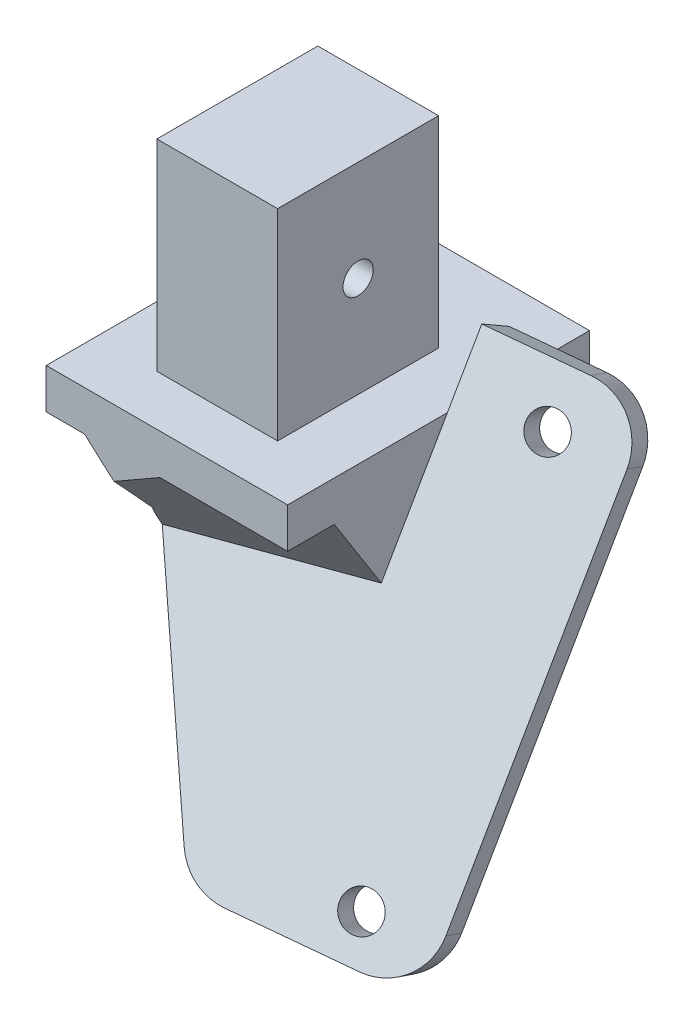
ISO-10303-21;
HEADER;
FILE_DESCRIPTION(('STEP AP214'),'2;1');
FILE_NAME('part.step','',(''),(''),'','','');
FILE_SCHEMA(('AUTOMOTIVE_DESIGN { 1 0 10303 214 1 1 1 1 }'));
ENDSEC;
DATA;
#1=APPLICATION_CONTEXT('core data for automotive mechanical design processes');
#2=APPLICATION_PROTOCOL_DEFINITION('international standard','automotive_design',2000,#1);
#3=PRODUCT_CONTEXT('',#1,'mechanical');
#4=PRODUCT('Part','Part','',(#3));
#5=PRODUCT_RELATED_PRODUCT_CATEGORY('part','',(#4));
#6=PRODUCT_DEFINITION_FORMATION('','',#4);
#7=PRODUCT_DEFINITION_CONTEXT('part definition',#1,'design');
#8=PRODUCT_DEFINITION('design','',#6,#7);
#9=PRODUCT_DEFINITION_SHAPE('','',#8);
#10=(LENGTH_UNIT() NAMED_UNIT(*) SI_UNIT(.MILLI.,.METRE.));
#11=(NAMED_UNIT(*) PLANE_ANGLE_UNIT() SI_UNIT($,.RADIAN.));
#12=(NAMED_UNIT(*) SI_UNIT($,.STERADIAN.) SOLID_ANGLE_UNIT());
#13=UNCERTAINTY_MEASURE_WITH_UNIT(LENGTH_MEASURE(1.E-05),#10,'distance_accuracy_value','');
#14=(GEOMETRIC_REPRESENTATION_CONTEXT(3) GLOBAL_UNCERTAINTY_ASSIGNED_CONTEXT((#13)) GLOBAL_UNIT_ASSIGNED_CONTEXT((#10,
#11,#12)) REPRESENTATION_CONTEXT('',''));
#15=CARTESIAN_POINT('',(0.,0.,0.));
#16=DIRECTION('',(0.,0.,1.));
#17=DIRECTION('',(1.,0.,0.));
#18=AXIS2_PLACEMENT_3D('',#15,#16,#17);
#19=CARTESIAN_POINT('',(0.,0.,0.));
#20=DIRECTION('',(0.,1.,0.));
#21=DIRECTION('',(0.,0.,-1.));
#22=AXIS2_PLACEMENT_3D('',#19,#20,#21);
#23=PLANE('',#22);
#24=DIRECTION('',(0.,0.,1.));
#25=VECTOR('',#24,1.);
#26=CARTESIAN_POINT('',(24.,0.,0.));
#27=LINE('',#26,#25);
#28=CARTESIAN_POINT('',(24.,0.,-4.62668487913654));
#29=VERTEX_POINT('',#28);
#30=CARTESIAN_POINT('',(24.,0.,0.));
#31=VERTEX_POINT('',#30);
#32=EDGE_CURVE('E313',#29,#31,#27,.T.);
#33=ORIENTED_EDGE('',*,*,#32,.T.);
#34=DIRECTION('',(-1.,0.,0.));
#35=VECTOR('',#34,1.);
#36=CARTESIAN_POINT('',(0.,0.,0.));
#37=LINE('',#36,#35);
#38=CARTESIAN_POINT('',(11.2882877676404,0.,0.));
#39=VERTEX_POINT('',#38);
#40=EDGE_CURVE('E303',#31,#39,#37,.T.);
#41=ORIENTED_EDGE('',*,*,#40,.T.);
#42=DIRECTION('',(-0.939692620785907,0.,0.342020143325673));
#43=VECTOR('',#42,1.);
#44=CARTESIAN_POINT('',(10.486715336839,0.,0.291748505420117));
#45=LINE('',#44,#43);
#46=EDGE_CURVE('E488',#29,#39,#45,.T.);
#47=ORIENTED_EDGE('',*,*,#46,.F.);
#48=EDGE_LOOP('',(#33,#41,#47));
#49=FACE_BOUND('',#48,.T.);
#50=ADVANCED_FACE('F41',(#49),#23,.F.);
#51=CARTESIAN_POINT('',(24.9018797354497,9.78209952844714,-19.5429186044547));
#52=DIRECTION('',(0.,-0.866025403784436,0.500000000000004));
#53=DIRECTION('',(0.,0.500000000000004,0.866025403784436));
#54=AXIS2_PLACEMENT_3D('',#51,#52,#53);
#55=PLANE('',#54);
#56=DIRECTION('',(0.953741925422946,-0.150313289241614,-0.260350254019269));
#57=VECTOR('',#56,1.);
#58=CARTESIAN_POINT('',(24.,8.3514866403127,-22.0208128126663));
#59=LINE('',#58,#57);
#60=CARTESIAN_POINT('',(24.,8.3514866403127,-22.0208128126663));
#61=VERTEX_POINT('',#60);
#62=CARTESIAN_POINT('',(31.6299354033836,7.14898032637979,-24.1036148448205));
#63=VERTEX_POINT('',#62);
#64=EDGE_CURVE('E557',#61,#63,#59,.T.);
#65=ORIENTED_EDGE('',*,*,#64,.F.);
#66=DIRECTION('',(0.,0.500000000000004,0.866025403784436));
#67=VECTOR('',#66,1.);
#68=CARTESIAN_POINT('',(24.,9.78209952844714,-19.5429186044547));
#69=LINE('',#68,#67);
#70=CARTESIAN_POINT('',(24.,9.92423914286713,-19.296725570511));
#71=VERTEX_POINT('',#70);
#72=EDGE_CURVE('E233',#61,#71,#69,.T.);
#73=ORIENTED_EDGE('',*,*,#72,.T.);
#74=DIRECTION('',(0.953741925422946,-0.150313289241614,-0.260350254019269));
#75=VECTOR('',#74,1.);
#76=CARTESIAN_POINT('',(24.9018797354497,9.78209952844714,-19.5429186044547));
#77=LINE('',#76,#75);
#78=CARTESIAN_POINT('',(32.5318151388333,8.57959321451423,-21.6257206366088));
#79=VERTEX_POINT('',#78);
#80=EDGE_CURVE('E545',#71,#79,#77,.T.);
#81=ORIENTED_EDGE('',*,*,#80,.T.);
#82=DIRECTION('',(-0.300626578483225,-0.476870962711477,-0.825964736070553));
#83=VECTOR('',#82,1.);
#84=CARTESIAN_POINT('',(32.5318151388333,8.57959321451423,-21.6257206366088));
#85=LINE('',#84,#83);
#86=EDGE_CURVE('E534',#63,#79,#85,.F.);
#87=ORIENTED_EDGE('',*,*,#86,.F.);
#88=EDGE_LOOP('',(#65,#73,#81,#87));
#89=FACE_BOUND('',#88,.T.);
#90=ADVANCED_FACE('F546',(#89),#55,.F.);
#91=CARTESIAN_POINT('',(-1.19973919209316,-1.9030944849345,-3.29625633951065));
#92=DIRECTION('',(-0.300626578483225,-0.476870962711477,-0.825964736070553));
#93=DIRECTION('',(0.,-0.866025403784436,0.500000000000004));
#94=AXIS2_PLACEMENT_3D('',#91,#92,#93);
#95=PLANE('',#94);
#96=CARTESIAN_POINT('',(31.1012022506988,4.47493612945446,-18.7351952555799));
#97=DIRECTION('',(0.300626578483225,0.476870962711477,0.825964736070553));
#98=DIRECTION('',(0.,-0.866025403784436,0.500000000000004));
#99=AXIS2_PLACEMENT_3D('',#96,#97,#98);
#100=CIRCLE('',#99,1.8);
#101=CARTESIAN_POINT('',(31.1012022506988,2.91609040264248,-17.8351952555799));
#102=VERTEX_POINT('',#101);
#103=EDGE_CURVE('E591',#102,#102,#100,.T.);
#104=ORIENTED_EDGE('',*,*,#103,.F.);
#105=EDGE_LOOP('',(#104));
#106=FACE_BOUND('',#105,.T.);
#107=CARTESIAN_POINT('',(31.1012022506988,-27.5680038105697,-0.235195255579716));
#108=DIRECTION('',(0.300626578483225,0.476870962711477,0.825964736070553));
#109=DIRECTION('',(0.,-0.866025403784436,0.500000000000004));
#110=AXIS2_PLACEMENT_3D('',#107,#108,#109);
#111=CIRCLE('',#110,1.8);
#112=CARTESIAN_POINT('',(31.1012022506988,-29.1268495373817,0.664804744420289));
#113=VERTEX_POINT('',#112);
#114=EDGE_CURVE('E234',#113,#113,#111,.T.);
#115=ORIENTED_EDGE('',*,*,#114,.F.);
#116=EDGE_LOOP('',(#115));
#117=FACE_BOUND('',#116,.T.);
#118=CARTESIAN_POINT('',(12.3820748241734,-6.27508701730732,-5.71546130331074));
#119=DIRECTION('',(0.300626578483225,0.476870962711477,0.825964736070553));
#120=DIRECTION('',(0.,-0.866025403784436,0.500000000000004));
#121=AXIS2_PLACEMENT_3D('',#118,#119,#120);
#122=CIRCLE('',#121,5.);
#123=CARTESIAN_POINT('',(8.11681126769891,-7.53935722507935,-3.43310558266799));
#124=VERTEX_POINT('',#123);
#125=CARTESIAN_POINT('',(8.04156708476999,-7.38435481355739,-3.49520962379743));
#126=VERTEX_POINT('',#125);
#127=EDGE_CURVE('E514',#124,#126,#122,.F.);
#128=ORIENTED_EDGE('',*,*,#127,.F.);
#129=DIRECTION('',(-0.426526355647448,0.841818815774649,-0.330781422310677));
#130=VECTOR('',#129,1.);
#131=CARTESIAN_POINT('',(4.4174632412376,-0.23809498526593,-6.30203873442501));
#132=LINE('',#131,#130);
#133=CARTESIAN_POINT('',(17.7402293776953,-26.5327308579097,4.03008605312881));
#134=VERTEX_POINT('',#133);
#135=EDGE_CURVE('E381',#134,#124,#132,.T.);
#136=ORIENTED_EDGE('',*,*,#135,.F.);
#137=CARTESIAN_POINT('',(22.0054929341698,-25.2684606501376,1.74773033248607));
#138=DIRECTION('',(0.300626578483225,0.476870962711477,0.825964736070553));
#139=DIRECTION('',(0.,-0.866025403784436,0.500000000000004));
#140=AXIS2_PLACEMENT_3D('',#137,#138,#139);
#141=CIRCLE('',#140,5.);
#142=CARTESIAN_POINT('',(22.0054929341698,-29.5985876690598,4.24773033248609));
#143=VERTEX_POINT('',#142);
#144=EDGE_CURVE('E521',#143,#134,#141,.F.);
#145=ORIENTED_EDGE('',*,*,#144,.F.);
#146=DIRECTION('',(-0.953741925422947,0.150313289241614,0.260350254019269));
#147=VECTOR('',#146,1.);
#148=CARTESIAN_POINT('',(37.300524765948,-32.0091418057779,0.0725280932950497));
#149=LINE('',#148,#147);
#150=CARTESIAN_POINT('',(32.5318151388333,-31.2575753595698,1.37427936339139));
#151=VERTEX_POINT('',#150);
#152=EDGE_CURVE('E252',#151,#143,#149,.T.);
#153=ORIENTED_EDGE('',*,*,#152,.F.);
#154=CARTESIAN_POINT('',(32.5318151388333,-26.9274483406477,-1.12572063660863));
#155=DIRECTION('',(0.300626578483225,0.476870962711477,0.825964736070553));
#156=DIRECTION('',(0.,-0.866025403784436,0.500000000000004));
#157=AXIS2_PLACEMENT_3D('',#154,#155,#156);
#158=CIRCLE('',#157,5.);
#159=CARTESIAN_POINT('',(37.300524765948,-27.6790147868557,-2.42747190670497));
#160=VERTEX_POINT('',#159);
#161=EDGE_CURVE('E526',#160,#151,#158,.F.);
#162=ORIENTED_EDGE('',*,*,#161,.F.);
#163=DIRECTION('',(0.,-0.866025403784436,0.500000000000004));
#164=VECTOR('',#163,1.);
#165=CARTESIAN_POINT('',(37.300524765948,7.82802676830616,-22.9274719067051));
#166=LINE('',#165,#164);
#167=CARTESIAN_POINT('',(37.300524765948,3.49789974938397,-20.4274719067051));
#168=VERTEX_POINT('',#167);
#169=EDGE_CURVE('E257',#168,#160,#166,.T.);
#170=ORIENTED_EDGE('',*,*,#169,.F.);
#171=CARTESIAN_POINT('',(32.5318151388333,4.24946619559204,-19.1257206366088));
#172=DIRECTION('',(0.300626578483225,0.476870962711477,0.825964736070553));
#173=DIRECTION('',(0.,-0.866025403784436,0.500000000000004));
#174=AXIS2_PLACEMENT_3D('',#171,#172,#173);
#175=CIRCLE('',#174,5.);
#176=EDGE_CURVE('E540',#79,#168,#175,.F.);
#177=ORIENTED_EDGE('',*,*,#176,.F.);
#178=ORIENTED_EDGE('',*,*,#80,.F.);
#179=DIRECTION('',(0.,-0.866025403784436,0.500000000000004));
#180=VECTOR('',#179,1.);
#181=CARTESIAN_POINT('',(24.,-5.87466749124286,-10.1752225724057));
#182=LINE('',#181,#180);
#183=CARTESIAN_POINT('',(24.,4.,-15.8763645066329));
#184=VERTEX_POINT('',#183);
#185=EDGE_CURVE('E554',#71,#184,#182,.T.);
#186=ORIENTED_EDGE('',*,*,#185,.T.);
#187=DIRECTION('',(0.,0.866025403784436,-0.500000000000004));
#188=VECTOR('',#187,1.);
#189=CARTESIAN_POINT('',(24.,-2.87466749124288,-11.9072733799746));
#190=LINE('',#189,#188);
#191=CARTESIAN_POINT('',(24.,-7.38435481355739,-9.30360419047525));
#192=VERTEX_POINT('',#191);
#193=EDGE_CURVE('E251',#192,#184,#190,.T.);
#194=ORIENTED_EDGE('',*,*,#193,.F.);
#195=DIRECTION('',(0.939692620785907,0.,-0.342020143325673));
#196=VECTOR('',#195,1.);
#197=CARTESIAN_POINT('',(25.3702172473642,-7.38435481355739,-9.802322482994));
#198=LINE('',#197,#196);
#199=EDGE_CURVE('E326',#126,#192,#198,.T.);
#200=ORIENTED_EDGE('',*,*,#199,.F.);
#201=EDGE_LOOP('',(#128,#136,#145,#153,#162,#170,#177,#178,#186,#194,#200));
#202=FACE_BOUND('',#201,.T.);
#203=ADVANCED_FACE('F587',(#106,#117,#202),#95,.F.);
#204=CARTESIAN_POINT('',(-2.10161892754284,-3.33370737306893,-5.7741505477223));
#205=DIRECTION('',(-0.300626578483225,-0.476870962711477,-0.825964736070553));
#206=DIRECTION('',(0.,-0.866025403784436,0.500000000000004));
#207=AXIS2_PLACEMENT_3D('',#204,#205,#206);
#208=PLANE('',#207);
#209=DIRECTION('',(0.,0.866025403784436,-0.500000000000004));
#210=VECTOR('',#209,1.);
#211=CARTESIAN_POINT('',(24.,-4.4474199937973,-14.6313606221299));
#212=LINE('',#211,#210);
#213=CARTESIAN_POINT('',(24.,-2.61564518644261,-15.6889363002509));
#214=VERTEX_POINT('',#213);
#215=CARTESIAN_POINT('',(24.,4.,-19.5084808295067));
#216=VERTEX_POINT('',#215);
#217=EDGE_CURVE('E218',#214,#216,#212,.T.);
#218=ORIENTED_EDGE('',*,*,#217,.T.);
#219=DIRECTION('',(0.,-0.866025403784436,0.500000000000004));
#220=VECTOR('',#219,1.);
#221=CARTESIAN_POINT('',(24.,-7.44741999379728,-12.899309814561));
#222=LINE('',#221,#220);
#223=EDGE_CURVE('E237',#61,#216,#222,.T.);
#224=ORIENTED_EDGE('',*,*,#223,.F.);
#225=ORIENTED_EDGE('',*,*,#64,.T.);
#226=CARTESIAN_POINT('',(31.6299354033836,2.81885330745761,-21.6036148448204));
#227=DIRECTION('',(0.300626578483225,0.476870962711477,0.825964736070553));
#228=DIRECTION('',(0.,-0.866025403784436,0.500000000000004));
#229=AXIS2_PLACEMENT_3D('',#226,#227,#228);
#230=CIRCLE('',#229,5.);
#231=CARTESIAN_POINT('',(36.3986450304983,2.06728686124954,-22.9053661149168));
#232=VERTEX_POINT('',#231);
#233=EDGE_CURVE('E505',#232,#63,#230,.T.);
#234=ORIENTED_EDGE('',*,*,#233,.F.);
#235=DIRECTION('',(0.,-0.866025403784436,0.500000000000004));
#236=VECTOR('',#235,1.);
#237=CARTESIAN_POINT('',(36.3986450304983,6.39741388017172,-25.4053661149168));
#238=LINE('',#237,#236);
#239=CARTESIAN_POINT('',(36.3986450304983,-29.1096276749902,-4.90536611491663));
#240=VERTEX_POINT('',#239);
#241=EDGE_CURVE('E559',#232,#240,#238,.T.);
#242=ORIENTED_EDGE('',*,*,#241,.T.);
#243=CARTESIAN_POINT('',(31.6299354033836,-28.3580612287821,-3.60361484482029));
#244=DIRECTION('',(0.300626578483225,0.476870962711477,0.825964736070553));
#245=DIRECTION('',(0.,-0.866025403784436,0.500000000000004));
#246=AXIS2_PLACEMENT_3D('',#243,#244,#245);
#247=CIRCLE('',#246,5.);
#248=CARTESIAN_POINT('',(31.6299354033836,-32.6881882477043,-1.10361484482027));
#249=VERTEX_POINT('',#248);
#250=EDGE_CURVE('E569',#249,#240,#247,.T.);
#251=ORIENTED_EDGE('',*,*,#250,.F.);
#252=DIRECTION('',(-0.953741925422946,0.150313289241614,0.260350254019269));
#253=VECTOR('',#252,1.);
#254=CARTESIAN_POINT('',(6.71148546160899,-28.7609474777343,5.69856570232354));
#255=LINE('',#254,#253);
#256=CARTESIAN_POINT('',(21.1036131987201,-31.0292005571942,1.76983612427443));
#257=VERTEX_POINT('',#256);
#258=EDGE_CURVE('E552',#249,#257,#255,.T.);
#259=ORIENTED_EDGE('',*,*,#258,.T.);
#260=CARTESIAN_POINT('',(21.1036131987201,-26.6990735382721,-0.730163875725593));
#261=DIRECTION('',(0.300626578483225,0.476870962711477,0.825964736070553));
#262=DIRECTION('',(0.,-0.866025403784436,0.500000000000004));
#263=AXIS2_PLACEMENT_3D('',#260,#261,#262);
#264=CIRCLE('',#263,5.);
#265=CARTESIAN_POINT('',(16.8383496422456,-27.9633437460441,1.55219184491716));
#266=VERTEX_POINT('',#265);
#267=EDGE_CURVE('E567',#266,#257,#264,.T.);
#268=ORIENTED_EDGE('',*,*,#267,.F.);
#269=DIRECTION('',(-0.426526355647448,0.841818815774649,-0.330781422310677));
#270=VECTOR('',#269,1.);
#271=CARTESIAN_POINT('',(3.51558350578792,-1.66870787340036,-8.77993294263667));
#272=LINE('',#271,#270);
#273=CARTESIAN_POINT('',(7.21493153224923,-8.96997011321379,-5.91099979087965));
#274=VERTEX_POINT('',#273);
#275=EDGE_CURVE('E589',#266,#274,#272,.T.);
#276=ORIENTED_EDGE('',*,*,#275,.T.);
#277=CARTESIAN_POINT('',(11.4801950887237,-7.70569990544176,-8.19335551152239));
#278=DIRECTION('',(0.300626578483225,0.476870962711477,0.825964736070553));
#279=DIRECTION('',(0.,-0.866025403784436,0.500000000000004));
#280=AXIS2_PLACEMENT_3D('',#277,#278,#279);
#281=CIRCLE('',#280,5.);
#282=CARTESIAN_POINT('',(6.71148546160899,-6.95413345923368,-6.89160424142605));
#283=VERTEX_POINT('',#282);
#284=EDGE_CURVE('E578',#283,#274,#281,.T.);
#285=ORIENTED_EDGE('',*,*,#284,.F.);
#286=DIRECTION('',(0.,0.866025403784436,-0.500000000000004));
#287=VECTOR('',#286,1.);
#288=CARTESIAN_POINT('',(6.71148546160899,11.0762210963497,-17.3014342976767));
#289=LINE('',#288,#287);
#290=CARTESIAN_POINT('',(6.71148546160899,-5.75156644620807,-7.58590663011496));
#291=VERTEX_POINT('',#290);
#292=EDGE_CURVE('E260',#283,#291,#289,.T.);
#293=ORIENTED_EDGE('',*,*,#292,.T.);
#294=DIRECTION('',(-0.680788787401634,0.713808179397935,-0.164330490088779));
#295=VECTOR('',#294,1.);
#296=CARTESIAN_POINT('',(5.16036488299063,-4.12521393168428,-7.96031997179764));
#297=LINE('',#296,#295);
#298=CARTESIAN_POINT('',(3.72062588134553,-2.61564518644261,-8.30784775151222));
#299=VERTEX_POINT('',#298);
#300=EDGE_CURVE('E52',#299,#291,#297,.F.);
#301=ORIENTED_EDGE('',*,*,#300,.F.);
#302=DIRECTION('',(-0.939692620785907,0.,0.342020143325673));
#303=VECTOR('',#302,1.);
#304=CARTESIAN_POINT('',(-2.23486024890906,-2.61564518644261,-6.1402280695143));
#305=LINE('',#304,#303);
#306=EDGE_CURVE('E250',#214,#299,#305,.T.);
#307=ORIENTED_EDGE('',*,*,#306,.F.);
#308=EDGE_LOOP('',(#218,#224,#225,#234,#242,#251,#259,#268,#276,#285,#293,#301,#307));
#309=FACE_BOUND('',#308,.T.);
#310=CARTESIAN_POINT('',(30.1993225152492,3.04432324132003,-21.2130894637915));
#311=DIRECTION('',(0.300626578483225,0.476870962711477,0.825964736070553));
#312=DIRECTION('',(0.,-0.866025403784436,0.500000000000004));
#313=AXIS2_PLACEMENT_3D('',#310,#311,#312);
#314=CIRCLE('',#313,1.8);
#315=CARTESIAN_POINT('',(30.1993225152492,1.48547751450805,-20.3130894637915));
#316=VERTEX_POINT('',#315);
#317=EDGE_CURVE('E599',#316,#316,#314,.T.);
#318=ORIENTED_EDGE('',*,*,#317,.T.);
#319=EDGE_LOOP('',(#318));
#320=FACE_BOUND('',#319,.T.);
#321=CARTESIAN_POINT('',(30.1993225152491,-28.9986166987041,-2.71308946379138));
#322=DIRECTION('',(0.300626578483225,0.476870962711477,0.825964736070553));
#323=DIRECTION('',(0.,-0.866025403784436,0.500000000000004));
#324=AXIS2_PLACEMENT_3D('',#321,#322,#323);
#325=CIRCLE('',#324,1.8);
#326=CARTESIAN_POINT('',(30.1993225152491,-30.5574624255161,-1.81308946379137));
#327=VERTEX_POINT('',#326);
#328=EDGE_CURVE('E597',#327,#327,#325,.T.);
#329=ORIENTED_EDGE('',*,*,#328,.T.);
#330=EDGE_LOOP('',(#329));
#331=FACE_BOUND('',#330,.T.);
#332=ADVANCED_FACE('F247',(#309,#320,#331),#208,.T.);
#333=CARTESIAN_POINT('',(24.,4.,0.));
#334=DIRECTION('',(-1.,0.,0.));
#335=DIRECTION('',(0.,0.,-1.));
#336=AXIS2_PLACEMENT_3D('',#333,#334,#335);
#337=PLANE('',#336);
#338=ORIENTED_EDGE('',*,*,#193,.T.);
#339=DIRECTION('',(0.,0.,1.));
#340=VECTOR('',#339,1.);
#341=CARTESIAN_POINT('',(24.,4.,0.));
#342=LINE('',#341,#340);
#343=CARTESIAN_POINT('',(24.,4.,0.));
#344=VERTEX_POINT('',#343);
#345=EDGE_CURVE('E224',#184,#344,#342,.T.);
#346=ORIENTED_EDGE('',*,*,#345,.T.);
#347=DIRECTION('',(0.,-1.,0.));
#348=VECTOR('',#347,1.);
#349=CARTESIAN_POINT('',(24.,4.,0.));
#350=LINE('',#349,#348);
#351=EDGE_CURVE('E499',#344,#31,#350,.T.);
#352=ORIENTED_EDGE('',*,*,#351,.T.);
#353=ORIENTED_EDGE('',*,*,#32,.F.);
#354=DIRECTION('',(0.,-0.84481073593832,-0.535065248771918));
#355=VECTOR('',#354,1.);
#356=CARTESIAN_POINT('',(24.,4.94621584021188,-1.49397349605606));
#357=LINE('',#356,#355);
#358=EDGE_CURVE('E378',#192,#29,#357,.F.);
#359=ORIENTED_EDGE('',*,*,#358,.F.);
#360=EDGE_LOOP('',(#338,#346,#352,#353,#359));
#361=FACE_BOUND('',#360,.T.);
#362=ADVANCED_FACE('F497',(#361),#337,.F.);
#363=CARTESIAN_POINT('',(0.,4.,0.));
#364=DIRECTION('',(0.,1.,0.));
#365=DIRECTION('',(0.,0.,-1.));
#366=AXIS2_PLACEMENT_3D('',#363,#364,#365);
#367=PLANE('',#366);
#368=DIRECTION('',(0.,0.,1.));
#369=VECTOR('',#368,1.);
#370=CARTESIAN_POINT('',(18.,4.,-5.));
#371=LINE('',#370,#369);
#372=CARTESIAN_POINT('',(18.,4.,-21.));
#373=VERTEX_POINT('',#372);
#374=CARTESIAN_POINT('',(18.,4.,-5.));
#375=VERTEX_POINT('',#374);
#376=EDGE_CURVE('E286',#373,#375,#371,.T.);
#377=ORIENTED_EDGE('',*,*,#376,.T.);
#378=DIRECTION('',(-1.,0.,0.));
#379=VECTOR('',#378,1.);
#380=CARTESIAN_POINT('',(6.00000000000001,4.,-5.));
#381=LINE('',#380,#379);
#382=CARTESIAN_POINT('',(6.00000000000001,4.,-5.));
#383=VERTEX_POINT('',#382);
#384=EDGE_CURVE('E273',#375,#383,#381,.T.);
#385=ORIENTED_EDGE('',*,*,#384,.T.);
#386=DIRECTION('',(0.,0.,-1.));
#387=VECTOR('',#386,1.);
#388=CARTESIAN_POINT('',(6.00000000000001,4.,-5.));
#389=LINE('',#388,#387);
#390=CARTESIAN_POINT('',(6.00000000000001,4.,-21.));
#391=VERTEX_POINT('',#390);
#392=EDGE_CURVE('E266',#383,#391,#389,.T.);
#393=ORIENTED_EDGE('',*,*,#392,.T.);
#394=DIRECTION('',(1.,0.,0.));
#395=VECTOR('',#394,1.);
#396=CARTESIAN_POINT('',(6.00000000000001,4.,-21.));
#397=LINE('',#396,#395);
#398=EDGE_CURVE('E283',#391,#373,#397,.T.);
#399=ORIENTED_EDGE('',*,*,#398,.T.);
#400=EDGE_LOOP('',(#377,#385,#393,#399));
#401=FACE_BOUND('',#400,.T.);
#402=ORIENTED_EDGE('',*,*,#345,.F.);
#403=DIRECTION('',(0.,0.,1.));
#404=VECTOR('',#403,1.);
#405=CARTESIAN_POINT('',(24.,4.,-23.5414123331734));
#406=LINE('',#405,#404);
#407=EDGE_CURVE('E227',#216,#184,#406,.T.);
#408=ORIENTED_EDGE('',*,*,#407,.F.);
#409=CARTESIAN_POINT('',(24.,4.,-30.));
#410=VERTEX_POINT('',#409);
#411=EDGE_CURVE('E213',#410,#216,#342,.T.);
#412=ORIENTED_EDGE('',*,*,#411,.F.);
#413=DIRECTION('',(1.,0.,0.));
#414=VECTOR('',#413,1.);
#415=CARTESIAN_POINT('',(0.,4.,-30.));
#416=LINE('',#415,#414);
#417=CARTESIAN_POINT('',(0.,4.,-30.));
#418=VERTEX_POINT('',#417);
#419=EDGE_CURVE('E302',#418,#410,#416,.T.);
#420=ORIENTED_EDGE('',*,*,#419,.F.);
#421=DIRECTION('',(0.,0.,-1.));
#422=VECTOR('',#421,1.);
#423=CARTESIAN_POINT('',(0.,4.,0.));
#424=LINE('',#423,#422);
#425=CARTESIAN_POINT('',(0.,4.,0.));
#426=VERTEX_POINT('',#425);
#427=EDGE_CURVE('E299',#426,#418,#424,.T.);
#428=ORIENTED_EDGE('',*,*,#427,.F.);
#429=DIRECTION('',(-1.,0.,0.));
#430=VECTOR('',#429,1.);
#431=CARTESIAN_POINT('',(0.,4.,0.));
#432=LINE('',#431,#430);
#433=EDGE_CURVE('E223',#344,#426,#432,.T.);
#434=ORIENTED_EDGE('',*,*,#433,.F.);
#435=EDGE_LOOP('',(#402,#408,#412,#420,#428,#434));
#436=FACE_BOUND('',#435,.T.);
#437=ADVANCED_FACE('F229',(#401,#436),#367,.T.);
#438=CARTESIAN_POINT('',(3.82069132181488,0.,0.));
#439=VERTEX_POINT('',#438);
#440=CARTESIAN_POINT('',(0.,0.,0.));
#441=VERTEX_POINT('',#440);
#442=EDGE_CURVE('E317',#439,#441,#37,.T.);
#443=ORIENTED_EDGE('',*,*,#442,.T.);
#444=DIRECTION('',(0.,0.,-1.));
#445=VECTOR('',#444,1.);
#446=CARTESIAN_POINT('',(0.,0.,0.));
#447=LINE('',#446,#445);
#448=CARTESIAN_POINT('',(0.,0.,-30.));
#449=VERTEX_POINT('',#448);
#450=EDGE_CURVE('E298',#441,#449,#447,.T.);
#451=ORIENTED_EDGE('',*,*,#450,.T.);
#452=DIRECTION('',(1.,0.,0.));
#453=VECTOR('',#452,1.);
#454=CARTESIAN_POINT('',(0.,0.,-30.));
#455=LINE('',#454,#453);
#456=CARTESIAN_POINT('',(24.,0.,-30.));
#457=VERTEX_POINT('',#456);
#458=EDGE_CURVE('E310',#449,#457,#455,.T.);
#459=ORIENTED_EDGE('',*,*,#458,.T.);
#460=CARTESIAN_POINT('',(24.,0.,-20.3658556115896));
#461=VERTEX_POINT('',#460);
#462=EDGE_CURVE('E314',#457,#461,#27,.T.);
#463=ORIENTED_EDGE('',*,*,#462,.T.);
#464=DIRECTION('',(0.939692620785907,0.,-0.342020143325673));
#465=VECTOR('',#464,1.);
#466=CARTESIAN_POINT('',(-3.73799314132519,0.,-10.2700517498671));
#467=LINE('',#466,#465);
#468=CARTESIAN_POINT('',(0.439642942078132,0.,-11.7905869338223));
#469=VERTEX_POINT('',#468);
#470=EDGE_CURVE('E328',#469,#461,#467,.T.);
#471=ORIENTED_EDGE('',*,*,#470,.F.);
#472=DIRECTION('',(-0.263342239326904,0.,-0.964702474852372));
#473=VECTOR('',#472,1.);
#474=CARTESIAN_POINT('',(1.09917027915965,0.,-9.37453831229634));
#475=LINE('',#474,#473);
#476=CARTESIAN_POINT('',(2.70089204368231,0.,-3.50694580526302));
#477=VERTEX_POINT('',#476);
#478=EDGE_CURVE('E331',#477,#469,#475,.T.);
#479=ORIENTED_EDGE('',*,*,#478,.F.);
#480=CARTESIAN_POINT('',(4.89402018745804,0.,2.65727949453189));
#481=CARTESIAN_POINT('',(4.01382894624458,0.,0.670319460041967));
#482=CARTESIAN_POINT('',(3.27079630282216,0.,-1.41812239966285));
#483=CARTESIAN_POINT('',(2.70089204368231,0.,-3.50694580526302));
#484=B_SPLINE_CURVE_WITH_KNOTS('',3,(#480,#481,#482,#483),.UNSPECIFIED.,.F.,.F.,(4,4),
(4.57093154388576,4.88424373170343),.UNSPECIFIED.);
#485=EDGE_CURVE('E337',#439,#477,#484,.T.);
#486=ORIENTED_EDGE('',*,*,#485,.F.);
#487=EDGE_LOOP('',(#443,#451,#459,#463,#471,#479,#486));
#488=FACE_BOUND('',#487,.T.);
#489=ADVANCED_FACE('F344',(#488),#23,.F.);
#490=CARTESIAN_POINT('',(18.,24.,-5.));
#491=DIRECTION('',(-1.,0.,0.));
#492=DIRECTION('',(0.,0.,-1.));
#493=AXIS2_PLACEMENT_3D('',#490,#491,#492);
#494=PLANE('',#493);
#495=CARTESIAN_POINT('',(18.,14.,-13.));
#496=DIRECTION('',(-1.,0.,0.));
#497=DIRECTION('',(0.,0.,1.));
#498=AXIS2_PLACEMENT_3D('',#495,#496,#497);
#499=CIRCLE('',#498,1.5);
#500=CARTESIAN_POINT('',(18.,14.,-11.5));
#501=VERTEX_POINT('',#500);
#502=EDGE_CURVE('E254',#501,#501,#499,.T.);
#503=ORIENTED_EDGE('',*,*,#502,.T.);
#504=EDGE_LOOP('',(#503));
#505=FACE_BOUND('',#504,.T.);
#506=ORIENTED_EDGE('',*,*,#376,.F.);
#507=DIRECTION('',(0.,-1.,0.));
#508=VECTOR('',#507,1.);
#509=CARTESIAN_POINT('',(18.,24.,-21.));
#510=LINE('',#509,#508);
#511=CARTESIAN_POINT('',(18.,24.,-21.));
#512=VERTEX_POINT('',#511);
#513=EDGE_CURVE('E294',#512,#373,#510,.T.);
#514=ORIENTED_EDGE('',*,*,#513,.F.);
#515=DIRECTION('',(0.,0.,1.));
#516=VECTOR('',#515,1.);
#517=CARTESIAN_POINT('',(18.,24.,-5.));
#518=LINE('',#517,#516);
#519=CARTESIAN_POINT('',(18.,24.,-5.));
#520=VERTEX_POINT('',#519);
#521=EDGE_CURVE('E275',#512,#520,#518,.T.);
#522=ORIENTED_EDGE('',*,*,#521,.T.);
#523=DIRECTION('',(0.,-1.,0.));
#524=VECTOR('',#523,1.);
#525=CARTESIAN_POINT('',(18.,24.,-5.));
#526=LINE('',#525,#524);
#527=EDGE_CURVE('E292',#520,#375,#526,.T.);
#528=ORIENTED_EDGE('',*,*,#527,.T.);
#529=EDGE_LOOP('',(#506,#514,#522,#528));
#530=FACE_BOUND('',#529,.T.);
#531=ADVANCED_FACE('F354',(#505,#530),#494,.F.);
#532=CARTESIAN_POINT('',(0.,4.,0.));
#533=DIRECTION('',(1.,0.,0.));
#534=DIRECTION('',(0.,0.,1.));
#535=AXIS2_PLACEMENT_3D('',#532,#533,#534);
#536=PLANE('',#535);
#537=ORIENTED_EDGE('',*,*,#450,.F.);
#538=DIRECTION('',(0.,-1.,0.));
#539=VECTOR('',#538,1.);
#540=CARTESIAN_POINT('',(0.,4.,0.));
#541=LINE('',#540,#539);
#542=EDGE_CURVE('E307',#426,#441,#541,.T.);
#543=ORIENTED_EDGE('',*,*,#542,.F.);
#544=ORIENTED_EDGE('',*,*,#427,.T.);
#545=DIRECTION('',(0.,-1.,0.));
#546=VECTOR('',#545,1.);
#547=CARTESIAN_POINT('',(0.,4.,-30.));
#548=LINE('',#547,#546);
#549=EDGE_CURVE('E244',#418,#449,#548,.T.);
#550=ORIENTED_EDGE('',*,*,#549,.T.);
#551=EDGE_LOOP('',(#537,#543,#544,#550));
#552=FACE_BOUND('',#551,.T.);
#553=ADVANCED_FACE('F470',(#552),#536,.F.);
#554=CARTESIAN_POINT('',(0.,4.,-30.));
#555=DIRECTION('',(0.,0.,1.));
#556=DIRECTION('',(-1.,0.,0.));
#557=AXIS2_PLACEMENT_3D('',#554,#555,#556);
#558=PLANE('',#557);
#559=ORIENTED_EDGE('',*,*,#458,.F.);
#560=ORIENTED_EDGE('',*,*,#549,.F.);
#561=ORIENTED_EDGE('',*,*,#419,.T.);
#562=DIRECTION('',(0.,-1.,0.));
#563=VECTOR('',#562,1.);
#564=CARTESIAN_POINT('',(24.,4.,-30.));
#565=LINE('',#564,#563);
#566=EDGE_CURVE('E219',#410,#457,#565,.T.);
#567=ORIENTED_EDGE('',*,*,#566,.T.);
#568=EDGE_LOOP('',(#559,#560,#561,#567));
#569=FACE_BOUND('',#568,.T.);
#570=ADVANCED_FACE('F684',(#569),#558,.F.);
#571=ORIENTED_EDGE('',*,*,#462,.F.);
#572=ORIENTED_EDGE('',*,*,#566,.F.);
#573=ORIENTED_EDGE('',*,*,#411,.T.);
#574=ORIENTED_EDGE('',*,*,#217,.F.);
#575=DIRECTION('',(0.,-0.488116069350405,0.872778725016777));
#576=VECTOR('',#575,1.);
#577=CARTESIAN_POINT('',(24.,-7.72317805212531,-6.55638299500066));
#578=LINE('',#577,#576);
#579=EDGE_CURVE('E12',#461,#214,#578,.T.);
#580=ORIENTED_EDGE('',*,*,#579,.F.);
#581=EDGE_LOOP('',(#571,#572,#573,#574,#580));
#582=FACE_BOUND('',#581,.T.);
#583=ADVANCED_FACE('F216',(#582),#337,.F.);
#584=CARTESIAN_POINT('',(0.,4.,0.));
#585=DIRECTION('',(0.,0.,-1.));
#586=DIRECTION('',(1.,0.,0.));
#587=AXIS2_PLACEMENT_3D('',#584,#585,#586);
#588=PLANE('',#587);
#589=ORIENTED_EDGE('',*,*,#40,.F.);
#590=ORIENTED_EDGE('',*,*,#351,.F.);
#591=ORIENTED_EDGE('',*,*,#433,.T.);
#592=ORIENTED_EDGE('',*,*,#542,.T.);
#593=ORIENTED_EDGE('',*,*,#442,.F.);
#594=CARTESIAN_POINT('',(6.75041122688828,-2.60778163853519,0.));
#595=CARTESIAN_POINT('',(6.63091366495885,-2.50704812057528,4.310139354026E-08));
#596=CARTESIAN_POINT('',(6.5117700823799,-2.40589508868888,5.33396422806928E-07));
#597=CARTESIAN_POINT('',(6.27261453045539,-2.20144802467374,1.89152551582587E-06));
#598=CARTESIAN_POINT('',(6.15261168665314,-2.09814331682844,2.76423012082665E-06));
#599=CARTESIAN_POINT('',(5.91174968210769,-1.88939542413768,4.3515895397889E-06));
#600=CARTESIAN_POINT('',(5.79089951759188,-1.78394186113436,5.0640544054162E-06));
#601=CARTESIAN_POINT('',(5.54835489710783,-1.57089868718561,6.05289727428703E-06));
#602=CARTESIAN_POINT('',(5.42666930924843,-1.4632989812427,6.32360196576936E-06));
#603=CARTESIAN_POINT('',(5.18246559031736,-1.24596650399289,6.32698697385845E-06));
#604=CARTESIAN_POINT('',(5.05995619755419,-1.13622391529595,6.05286731526203E-06));
#605=CARTESIAN_POINT('',(4.81411641250837,-0.914608990186521,5.06752552006209E-06));
#606=CARTESIAN_POINT('',(4.69079462815453,-0.802727105954399,4.35093492849829E-06));
#607=CARTESIAN_POINT('',(4.44334132198181,-0.576837423906528,2.76525250803213E-06));
#608=CARTESIAN_POINT('',(4.31921827633043,-0.462820342376104,1.89440683671371E-06));
#609=CARTESIAN_POINT('',(4.07017364466965,-0.232664068438034,5.23772311360385E-07));
#610=CARTESIAN_POINT('',(3.94526040446976,-0.116515844584746,2.85713381097432E-08));
#611=CARTESIAN_POINT('',(3.82069132181467,0.,0.));
#612=B_SPLINE_CURVE_WITH_KNOTS('',3,(#594,#595,#596,#597,#598,#599,#600,#601,#602,#603,#604,
#605,#606,#607,#608,#609,#610,#611),.UNSPECIFIED.,.F.,.F.,(4,2,2,2,2,2,2,2,4),(0.,
0.468871970438724,0.943897631426633,1.42506658795273,1.91236767786124,2.40578898719397,
2.90531786514872,3.41094093867571,3.9226441267314),.UNSPECIFIED.);
#613=CARTESIAN_POINT('',(6.75041122688828,-2.60778163853519,0.));
#614=VERTEX_POINT('',#613);
#615=EDGE_CURVE('E443',#614,#439,#612,.T.);
#616=ORIENTED_EDGE('',*,*,#615,.F.);
#617=DIRECTION('',(0.867029906258276,0.498256100468188,0.));
#618=VECTOR('',#617,1.);
#619=CARTESIAN_POINT('',(4.53043239226129,-3.88353693749215,0.));
#620=LINE('',#619,#618);
#621=EDGE_CURVE('E370',#39,#614,#620,.F.);
#622=ORIENTED_EDGE('',*,*,#621,.F.);
#623=EDGE_LOOP('',(#589,#590,#591,#592,#593,#616,#622));
#624=FACE_BOUND('',#623,.T.);
#625=ADVANCED_FACE('F356',(#624),#588,.F.);
#626=CARTESIAN_POINT('',(6.00000000000001,24.,-5.));
#627=DIRECTION('',(1.,0.,0.));
#628=DIRECTION('',(0.,0.,1.));
#629=AXIS2_PLACEMENT_3D('',#626,#627,#628);
#630=PLANE('',#629);
#631=CARTESIAN_POINT('',(5.99999999999999,14.,-13.));
#632=DIRECTION('',(-1.,0.,0.));
#633=DIRECTION('',(0.,0.,1.));
#634=AXIS2_PLACEMENT_3D('',#631,#632,#633);
#635=CIRCLE('',#634,1.5);
#636=CARTESIAN_POINT('',(5.99999999999999,14.,-11.5));
#637=VERTEX_POINT('',#636);
#638=EDGE_CURVE('E263',#637,#637,#635,.T.);
#639=ORIENTED_EDGE('',*,*,#638,.F.);
#640=EDGE_LOOP('',(#639));
#641=FACE_BOUND('',#640,.T.);
#642=ORIENTED_EDGE('',*,*,#392,.F.);
#643=DIRECTION('',(0.,-1.,0.));
#644=VECTOR('',#643,1.);
#645=CARTESIAN_POINT('',(6.00000000000001,24.,-5.));
#646=LINE('',#645,#644);
#647=CARTESIAN_POINT('',(6.00000000000001,24.,-5.));
#648=VERTEX_POINT('',#647);
#649=EDGE_CURVE('E280',#648,#383,#646,.T.);
#650=ORIENTED_EDGE('',*,*,#649,.F.);
#651=DIRECTION('',(0.,0.,-1.));
#652=VECTOR('',#651,1.);
#653=CARTESIAN_POINT('',(6.00000000000001,24.,-5.));
#654=LINE('',#653,#652);
#655=CARTESIAN_POINT('',(6.00000000000001,24.,-21.));
#656=VERTEX_POINT('',#655);
#657=EDGE_CURVE('E269',#648,#656,#654,.T.);
#658=ORIENTED_EDGE('',*,*,#657,.T.);
#659=DIRECTION('',(0.,-1.,0.));
#660=VECTOR('',#659,1.);
#661=CARTESIAN_POINT('',(6.00000000000001,24.,-21.));
#662=LINE('',#661,#660);
#663=EDGE_CURVE('E296',#656,#391,#662,.T.);
#664=ORIENTED_EDGE('',*,*,#663,.T.);
#665=EDGE_LOOP('',(#642,#650,#658,#664));
#666=FACE_BOUND('',#665,.T.);
#667=ADVANCED_FACE('F360',(#641,#666),#630,.F.);
#668=CARTESIAN_POINT('',(6.00000000000001,24.,-21.));
#669=DIRECTION('',(0.,0.,1.));
#670=DIRECTION('',(-1.,0.,0.));
#671=AXIS2_PLACEMENT_3D('',#668,#669,#670);
#672=PLANE('',#671);
#673=ORIENTED_EDGE('',*,*,#398,.F.);
#674=ORIENTED_EDGE('',*,*,#663,.F.);
#675=DIRECTION('',(1.,0.,0.));
#676=VECTOR('',#675,1.);
#677=CARTESIAN_POINT('',(6.00000000000001,24.,-21.));
#678=LINE('',#677,#676);
#679=EDGE_CURVE('E272',#656,#512,#678,.T.);
#680=ORIENTED_EDGE('',*,*,#679,.T.);
#681=ORIENTED_EDGE('',*,*,#513,.T.);
#682=EDGE_LOOP('',(#673,#674,#680,#681));
#683=FACE_BOUND('',#682,.T.);
#684=ADVANCED_FACE('F650',(#683),#672,.F.);
#685=CARTESIAN_POINT('',(6.00000000000001,24.,-5.));
#686=DIRECTION('',(0.,0.,-1.));
#687=DIRECTION('',(1.,0.,0.));
#688=AXIS2_PLACEMENT_3D('',#685,#686,#687);
#689=PLANE('',#688);
#690=ORIENTED_EDGE('',*,*,#384,.F.);
#691=ORIENTED_EDGE('',*,*,#527,.F.);
#692=DIRECTION('',(-1.,0.,0.));
#693=VECTOR('',#692,1.);
#694=CARTESIAN_POINT('',(6.00000000000001,24.,-5.));
#695=LINE('',#694,#693);
#696=EDGE_CURVE('E278',#520,#648,#695,.T.);
#697=ORIENTED_EDGE('',*,*,#696,.T.);
#698=ORIENTED_EDGE('',*,*,#649,.T.);
#699=EDGE_LOOP('',(#690,#691,#697,#698));
#700=FACE_BOUND('',#699,.T.);
#701=ADVANCED_FACE('F646',(#700),#689,.F.);
#702=CARTESIAN_POINT('',(0.,24.,0.));
#703=DIRECTION('',(0.,1.,0.));
#704=DIRECTION('',(0.,0.,-1.));
#705=AXIS2_PLACEMENT_3D('',#702,#703,#704);
#706=PLANE('',#705);
#707=ORIENTED_EDGE('',*,*,#657,.F.);
#708=ORIENTED_EDGE('',*,*,#696,.F.);
#709=ORIENTED_EDGE('',*,*,#521,.F.);
#710=ORIENTED_EDGE('',*,*,#679,.F.);
#711=EDGE_LOOP('',(#707,#708,#709,#710));
#712=FACE_BOUND('',#711,.T.);
#713=ADVANCED_FACE('F642',(#712),#706,.T.);
#714=CARTESIAN_POINT('',(5.99999999999999,14.,-13.));
#715=DIRECTION('',(1.,0.,0.));
#716=DIRECTION('',(0.,0.,1.));
#717=AXIS2_PLACEMENT_3D('',#714,#715,#716);
#718=CYLINDRICAL_SURFACE('',#717,1.5);
#719=ORIENTED_EDGE('',*,*,#638,.T.);
#720=EDGE_LOOP('',(#719));
#721=FACE_BOUND('',#720,.T.);
#722=ORIENTED_EDGE('',*,*,#502,.F.);
#723=EDGE_LOOP('',(#722));
#724=FACE_BOUND('',#723,.T.);
#725=ADVANCED_FACE('F638',(#721,#724),#718,.F.);
#726=CARTESIAN_POINT('',(7.61336519705867,12.5068339844842,-14.823540089465));
#727=DIRECTION('',(0.953741925422946,-0.150313289241614,-0.260350254019269));
#728=DIRECTION('',(0.263342239326904,0.,0.964702474852372));
#729=AXIS2_PLACEMENT_3D('',#726,#727,#728);
#730=PLANE('',#729);
#731=ORIENTED_EDGE('',*,*,#292,.F.);
#732=DIRECTION('',(-0.300626578483225,-0.476870962711477,-0.825964736070553));
#733=VECTOR('',#732,1.);
#734=CARTESIAN_POINT('',(7.61336519705867,-5.52352057109926,-4.41371003321439));
#735=LINE('',#734,#733);
#736=CARTESIAN_POINT('',(7.46960167079705,-5.75156644620807,-4.80869707535936));
#737=VERTEX_POINT('',#736);
#738=EDGE_CURVE('E243',#737,#283,#735,.T.);
#739=ORIENTED_EDGE('',*,*,#738,.F.);
#740=DIRECTION('',(0.263342239326904,0.,0.964702474852372));
#741=VECTOR('',#740,1.);
#742=CARTESIAN_POINT('',(6.76975964172406,-5.75156644620807,-7.37243063811046));
#743=LINE('',#742,#741);
#744=EDGE_CURVE('E495',#291,#737,#743,.T.);
#745=ORIENTED_EDGE('',*,*,#744,.F.);
#746=EDGE_LOOP('',(#731,#739,#745));
#747=FACE_BOUND('',#746,.T.);
#748=ADVANCED_FACE('F641',(#747),#730,.F.);
#749=CARTESIAN_POINT('',(37.300524765948,7.82802676830616,-22.9274719067051));
#750=DIRECTION('',(-0.953741925422946,0.150313289241614,0.260350254019269));
#751=DIRECTION('',(-0.263342239326904,0.,-0.964702474852372));
#752=AXIS2_PLACEMENT_3D('',#749,#750,#751);
#753=PLANE('',#752);
#754=ORIENTED_EDGE('',*,*,#241,.F.);
#755=DIRECTION('',(-0.300626578483225,-0.476870962711477,-0.825964736070553));
#756=VECTOR('',#755,1.);
#757=CARTESIAN_POINT('',(37.300524765948,3.49789974938397,-20.4274719067051));
#758=LINE('',#757,#756);
#759=EDGE_CURVE('E531',#168,#232,#758,.T.);
#760=ORIENTED_EDGE('',*,*,#759,.F.);
#761=ORIENTED_EDGE('',*,*,#169,.T.);
#762=DIRECTION('',(-0.300626578483225,-0.476870962711477,-0.825964736070553));
#763=VECTOR('',#762,1.);
#764=CARTESIAN_POINT('',(37.300524765948,-27.6790147868557,-2.42747190670497));
#765=LINE('',#764,#763);
#766=EDGE_CURVE('E533',#240,#160,#765,.F.);
#767=ORIENTED_EDGE('',*,*,#766,.F.);
#768=EDGE_LOOP('',(#754,#760,#761,#767));
#769=FACE_BOUND('',#768,.T.);
#770=ADVANCED_FACE('F636',(#769),#753,.F.);
#771=CARTESIAN_POINT('',(7.61336519705866,-27.3303345895999,8.1764599105352));
#772=DIRECTION('',(0.,0.866025403784436,-0.500000000000004));
#773=DIRECTION('',(0.,-0.500000000000004,-0.866025403784436));
#774=AXIS2_PLACEMENT_3D('',#771,#772,#773);
#775=PLANE('',#774);
#776=ORIENTED_EDGE('',*,*,#258,.F.);
#777=DIRECTION('',(-0.300626578483225,-0.476870962711477,-0.825964736070553));
#778=VECTOR('',#777,1.);
#779=CARTESIAN_POINT('',(32.5318151388333,-31.2575753595698,1.37427936339139));
#780=LINE('',#779,#778);
#781=EDGE_CURVE('E520',#151,#249,#780,.T.);
#782=ORIENTED_EDGE('',*,*,#781,.F.);
#783=ORIENTED_EDGE('',*,*,#152,.T.);
#784=DIRECTION('',(-0.300626578483225,-0.476870962711477,-0.825964736070553));
#785=VECTOR('',#784,1.);
#786=CARTESIAN_POINT('',(22.0054929341698,-29.5985876690598,4.24773033248609));
#787=LINE('',#786,#785);
#788=EDGE_CURVE('E523',#257,#143,#787,.F.);
#789=ORIENTED_EDGE('',*,*,#788,.F.);
#790=EDGE_LOOP('',(#776,#782,#783,#789));
#791=FACE_BOUND('',#790,.T.);
#792=ADVANCED_FACE('F571',(#791),#775,.F.);
#793=CARTESIAN_POINT('',(24.,14.,-23.5414123331734));
#794=DIRECTION('',(-1.,0.,0.));
#795=DIRECTION('',(0.,0.,-1.));
#796=AXIS2_PLACEMENT_3D('',#793,#794,#795);
#797=PLANE('',#796);
#798=ORIENTED_EDGE('',*,*,#185,.F.);
#799=ORIENTED_EDGE('',*,*,#72,.F.);
#800=ORIENTED_EDGE('',*,*,#223,.T.);
#801=ORIENTED_EDGE('',*,*,#407,.T.);
#802=EDGE_LOOP('',(#798,#799,#800,#801));
#803=FACE_BOUND('',#802,.T.);
#804=ADVANCED_FACE('F238',(#803),#797,.T.);
#805=CARTESIAN_POINT('',(4.4174632412376,-0.23809498526593,-6.30203873442501));
#806=DIRECTION('',(0.853052711294897,0.252854041554406,-0.45647114412855));
#807=DIRECTION('',(0.471802636914221,0.,0.881704186108236));
#808=AXIS2_PLACEMENT_3D('',#805,#806,#807);
#809=PLANE('',#808);
#810=ORIENTED_EDGE('',*,*,#275,.F.);
#811=DIRECTION('',(-0.300626578483225,-0.476870962711477,-0.825964736070553));
#812=VECTOR('',#811,1.);
#813=CARTESIAN_POINT('',(17.7402293776953,-26.5327308579097,4.03008605312881));
#814=LINE('',#813,#812);
#815=EDGE_CURVE('E576',#134,#266,#814,.T.);
#816=ORIENTED_EDGE('',*,*,#815,.F.);
#817=ORIENTED_EDGE('',*,*,#135,.T.);
#818=DIRECTION('',(-0.300626578483225,-0.476870962711477,-0.825964736070553));
#819=VECTOR('',#818,1.);
#820=CARTESIAN_POINT('',(8.11681126769891,-7.53935722507936,-3.43310558266799));
#821=LINE('',#820,#819);
#822=EDGE_CURVE('E516',#274,#124,#821,.F.);
#823=ORIENTED_EDGE('',*,*,#822,.F.);
#824=EDGE_LOOP('',(#810,#816,#817,#823));
#825=FACE_BOUND('',#824,.T.);
#826=ADVANCED_FACE('F618',(#825),#809,.F.);
#827=CARTESIAN_POINT('',(31.1012022506988,-27.5680038105697,-0.235195255579716));
#828=DIRECTION('',(-0.300626578483225,-0.476870962711477,-0.825964736070553));
#829=DIRECTION('',(0.,-0.866025403784436,0.500000000000004));
#830=AXIS2_PLACEMENT_3D('',#827,#828,#829);
#831=CYLINDRICAL_SURFACE('',#830,1.8);
#832=ORIENTED_EDGE('',*,*,#114,.T.);
#833=EDGE_LOOP('',(#832));
#834=FACE_BOUND('',#833,.T.);
#835=ORIENTED_EDGE('',*,*,#328,.F.);
#836=EDGE_LOOP('',(#835));
#837=FACE_BOUND('',#836,.T.);
#838=ADVANCED_FACE('F615',(#834,#837),#831,.F.);
#839=CARTESIAN_POINT('',(31.1012022506988,4.47493612945446,-18.7351952555799));
#840=DIRECTION('',(-0.300626578483225,-0.476870962711477,-0.825964736070553));
#841=DIRECTION('',(0.,-0.866025403784436,0.500000000000004));
#842=AXIS2_PLACEMENT_3D('',#839,#840,#841);
#843=CYLINDRICAL_SURFACE('',#842,1.8);
#844=ORIENTED_EDGE('',*,*,#103,.T.);
#845=EDGE_LOOP('',(#844));
#846=FACE_BOUND('',#845,.T.);
#847=ORIENTED_EDGE('',*,*,#317,.F.);
#848=EDGE_LOOP('',(#847));
#849=FACE_BOUND('',#848,.T.);
#850=ADVANCED_FACE('F468',(#846,#849),#843,.F.);
#851=CARTESIAN_POINT('',(12.3820748241734,-6.27508701730732,-5.71546130331074));
#852=DIRECTION('',(-0.300626578483225,-0.476870962711477,-0.825964736070553));
#853=DIRECTION('',(0.,-0.866025403784436,0.500000000000004));
#854=AXIS2_PLACEMENT_3D('',#851,#852,#853);
#855=CYLINDRICAL_SURFACE('',#854,5.);
#856=ORIENTED_EDGE('',*,*,#738,.T.);
#857=ORIENTED_EDGE('',*,*,#284,.T.);
#858=ORIENTED_EDGE('',*,*,#822,.T.);
#859=ORIENTED_EDGE('',*,*,#127,.T.);
#860=CARTESIAN_POINT('',(13.0195377796552,-5.26390705175925,-3.96404622738574));
#861=DIRECTION('',(-0.293905668762353,0.511433787155543,-0.807499188374262));
#862=DIRECTION('',(-0.174920657184531,-0.859322687560231,-0.480590555810654));
#863=AXIS2_PLACEMENT_3D('',#860,#861,#862);
#864=ELLIPSE('',#863,9.77643660933833,5.);
#865=CARTESIAN_POINT('',(8.35734356656178,-5.09064051359298,-2.15740704940958));
#866=VERTEX_POINT('',#865);
#867=EDGE_CURVE('E377',#866,#126,#864,.F.);
#868=ORIENTED_EDGE('',*,*,#867,.F.);
#869=CARTESIAN_POINT('',(7.46960167079705,-5.75156644620807,-4.80869707535936));
#870=CARTESIAN_POINT('',(8.03964141795718,-5.29934426630873,-2.98101358066408));
#871=CARTESIAN_POINT('',(8.70402134184332,-4.83478737776966,-1.1321565168559));
#872=CARTESIAN_POINT('',(9.43057918925841,-4.38038471461259,0.648372000071706));
#873=B_SPLINE_CURVE_WITH_KNOTS('',3,(#869,#870,#871,#872),.UNSPECIFIED.,.F.,.F.,(4,4),
(4.57093154388576,4.88424373170343),.UNSPECIFIED.);
#874=CARTESIAN_POINT('',(7.61500115141529,-5.63754360258485,-4.34847472093781));
#875=VERTEX_POINT('',#874);
#876=EDGE_CURVE('E444',#875,#866,#873,.T.);
#877=ORIENTED_EDGE('',*,*,#876,.F.);
#878=CARTESIAN_POINT('',(7.46960167079705,-5.75156644620807,-4.80869707535936));
#879=CARTESIAN_POINT('',(8.03964141795718,-5.29934426630873,-2.98101358066408));
#880=CARTESIAN_POINT('',(8.70402134184332,-4.83478737776966,-1.1321565168559));
#881=CARTESIAN_POINT('',(9.43057918925841,-4.38038471461259,0.648372000071706));
#882=B_SPLINE_CURVE_WITH_KNOTS('',3,(#878,#879,#880,#881),.UNSPECIFIED.,.F.,.F.,(4,4),
(4.57093154388576,4.88424373170343),.UNSPECIFIED.);
#883=EDGE_CURVE('E485',#737,#875,#882,.T.);
#884=ORIENTED_EDGE('',*,*,#883,.F.);
#885=EDGE_LOOP('',(#856,#857,#858,#859,#868,#877,#884));
#886=FACE_BOUND('',#885,.T.);
#887=ADVANCED_FACE('F457',(#886),#855,.T.);
#888=CARTESIAN_POINT('',(22.0054929341698,-25.2684606501376,1.74773033248606));
#889=DIRECTION('',(-0.300626578483225,-0.476870962711477,-0.825964736070553));
#890=DIRECTION('',(0.,-0.866025403784436,0.500000000000004));
#891=AXIS2_PLACEMENT_3D('',#888,#889,#890);
#892=CYLINDRICAL_SURFACE('',#891,5.);
#893=ORIENTED_EDGE('',*,*,#144,.T.);
#894=ORIENTED_EDGE('',*,*,#815,.T.);
#895=ORIENTED_EDGE('',*,*,#267,.T.);
#896=ORIENTED_EDGE('',*,*,#788,.T.);
#897=EDGE_LOOP('',(#893,#894,#895,#896));
#898=FACE_BOUND('',#897,.T.);
#899=ADVANCED_FACE('F467',(#898),#892,.T.);
#900=CARTESIAN_POINT('',(32.5318151388333,-26.9274483406477,-1.12572063660863));
#901=DIRECTION('',(-0.300626578483225,-0.476870962711477,-0.825964736070553));
#902=DIRECTION('',(0.,-0.866025403784436,0.500000000000004));
#903=AXIS2_PLACEMENT_3D('',#900,#901,#902);
#904=CYLINDRICAL_SURFACE('',#903,5.);
#905=ORIENTED_EDGE('',*,*,#161,.T.);
#906=ORIENTED_EDGE('',*,*,#781,.T.);
#907=ORIENTED_EDGE('',*,*,#250,.T.);
#908=ORIENTED_EDGE('',*,*,#766,.T.);
#909=EDGE_LOOP('',(#905,#906,#907,#908));
#910=FACE_BOUND('',#909,.T.);
#911=ADVANCED_FACE('F586',(#910),#904,.T.);
#912=CARTESIAN_POINT('',(32.5318151388333,4.24946619559204,-19.1257206366088));
#913=DIRECTION('',(-0.300626578483225,-0.476870962711477,-0.825964736070553));
#914=DIRECTION('',(0.,-0.866025403784436,0.500000000000004));
#915=AXIS2_PLACEMENT_3D('',#912,#913,#914);
#916=CYLINDRICAL_SURFACE('',#915,5.);
#917=ORIENTED_EDGE('',*,*,#176,.T.);
#918=ORIENTED_EDGE('',*,*,#759,.T.);
#919=ORIENTED_EDGE('',*,*,#233,.T.);
#920=ORIENTED_EDGE('',*,*,#86,.T.);
#921=EDGE_LOOP('',(#917,#918,#919,#920));
#922=FACE_BOUND('',#921,.T.);
#923=ADVANCED_FACE('F399',(#922),#916,.T.);
#924=CARTESIAN_POINT('',(-3.73799314132519,0.,-10.2700517498671));
#925=DIRECTION('',(0.174920657184531,0.859322687560231,0.480590555810654));
#926=DIRECTION('',(0.939692620785907,0.,-0.342020143325673));
#927=AXIS2_PLACEMENT_3D('',#924,#925,#926);
#928=PLANE('',#927);
#929=ORIENTED_EDGE('',*,*,#579,.T.);
#930=ORIENTED_EDGE('',*,*,#306,.T.);
#931=DIRECTION('',(-0.601676812556604,0.479665114902797,-0.638675497241762));
#932=VECTOR('',#931,1.);
#933=CARTESIAN_POINT('',(-0.488418389994711,0.739863388775156,-12.7757171904029));
#934=LINE('',#933,#932);
#935=EDGE_CURVE('E60',#299,#469,#934,.T.);
#936=ORIENTED_EDGE('',*,*,#935,.T.);
#937=ORIENTED_EDGE('',*,*,#470,.T.);
#938=EDGE_LOOP('',(#929,#930,#936,#937));
#939=FACE_BOUND('',#938,.T.);
#940=ADVANCED_FACE('F43',(#939),#928,.F.);
#941=CARTESIAN_POINT('',(4.93533162500271,-5.75156644620807,-14.0924967095195));
#942=DIRECTION('',(-0.731621506531189,-0.65180008850812,0.199716338344763));
#943=DIRECTION('',(-0.263342239326904,0.,-0.964702474852372));
#944=AXIS2_PLACEMENT_3D('',#941,#942,#943);
#945=PLANE('',#944);
#946=ORIENTED_EDGE('',*,*,#935,.F.);
#947=ORIENTED_EDGE('',*,*,#300,.T.);
#948=ORIENTED_EDGE('',*,*,#744,.T.);
#949=CARTESIAN_POINT('',(2.70089204368231,0.,-3.50694580526302));
#950=CARTESIAN_POINT('',(7.46960167079705,-5.75156644620807,-4.80869707535936));
#951=B_SPLINE_CURVE_WITH_KNOTS('',1,(#949,#950),.UNSPECIFIED.,.F.,.F.,(2,2),(0.,1.),.UNSPECIFIED.);
#952=EDGE_CURVE('E382',#737,#477,#951,.F.);
#953=ORIENTED_EDGE('',*,*,#952,.T.);
#954=ORIENTED_EDGE('',*,*,#478,.T.);
#955=EDGE_LOOP('',(#946,#947,#948,#953,#954));
#956=FACE_BOUND('',#955,.T.);
#957=ADVANCED_FACE('F405',(#956),#945,.T.);
#958=CARTESIAN_POINT('',(7.46960167079705,-5.75156644620807,-4.80869707535936));
#959=CARTESIAN_POINT('',(8.03964141795718,-5.29934426630873,-2.98101358066408));
#960=CARTESIAN_POINT('',(8.70402134184332,-4.83478737776966,-1.1321565168559));
#961=CARTESIAN_POINT('',(9.43057918925841,-4.38038471461259,0.648372000071706));
#962=CARTESIAN_POINT('',(2.70089204368231,0.,-3.50694580526302));
#963=CARTESIAN_POINT('',(3.27079630282216,0.,-1.41812239966285));
#964=CARTESIAN_POINT('',(4.01382894624458,0.,0.670319460041967));
#965=CARTESIAN_POINT('',(4.89402018745804,0.,2.65727949453189));
#966=B_SPLINE_SURFACE_WITH_KNOTS('',1,3,((#958,#959,#960,#961),(#962,#963,#964,#965)),
.UNSPECIFIED.,.F.,.F.,.F.,(2,2),(4,4),(0.,1.),(4.57093154388576,4.88424373170343),.UNSPECIFIED.);
#967=CARTESIAN_POINT('',(8.35735579736653,-5.09063335754856,-2.1574069687407));
#968=CARTESIAN_POINT('',(8.29577670116588,-4.98638220947255,-2.06896628249549));
#969=CARTESIAN_POINT('',(8.23363951041652,-4.88245607129791,-1.98053151747535));
#970=CARTESIAN_POINT('',(8.10796051281913,-4.67472238748587,-1.80322852579589));
#971=CARTESIAN_POINT('',(8.04441317853236,-4.57091811946987,-1.71436037664816));
#972=CARTESIAN_POINT('',(7.91593067282548,-4.36343739461719,-1.53619876779967));
#973=CARTESIAN_POINT('',(7.85099015212884,-4.25976417004422,-1.44690540249529));
#974=CARTESIAN_POINT('',(7.7197371485177,-4.05255284570937,-1.2679017876375));
#975=CARTESIAN_POINT('',(7.65341948038975,-3.94901793158374,-1.17819165299235));
#976=CARTESIAN_POINT('',(7.51942753116447,-3.74208893963183,-0.99836299560091));
#977=CARTESIAN_POINT('',(7.45174821746603,-3.6386980011774,-0.90824461082973));
#978=CARTESIAN_POINT('',(7.31504762356058,-3.43206100586562,-0.727608078262385));
#979=CARTESIAN_POINT('',(7.24602145174089,-3.3288180422252,-0.637090094346698));
#980=CARTESIAN_POINT('',(7.10664117175274,-3.12247947633823,-0.455663055034237));
#981=CARTESIAN_POINT('',(7.03628230242157,-3.0193869217756,-0.364754191976759));
#982=CARTESIAN_POINT('',(6.89424963949005,-2.81334989855406,-0.182554312141849));
#983=CARTESIAN_POINT('',(6.82257120336115,-2.71040843175433,-0.0912635195179797));
#984=CARTESIAN_POINT('',(6.75041122688828,-2.60778163853519,0.));
#985=B_SPLINE_CURVE_WITH_KNOTS('',3,(#967,#968,#969,#970,#971,#972,#973,#974,#975,#976,#977,
#978,#979,#980,#981,#982,#983,#984),.UNSPECIFIED.,.F.,.F.,(4,2,2,2,2,2,2,2,4),(0.,
0.449818610753367,0.901919698890858,1.35628055600098,1.81288129575535,2.27170487520789,
2.73273711616481,3.19596672674386,3.66138532322962),.UNSPECIFIED.);
#986=EDGE_CURVE('E68',#866,#614,#985,.T.);
#987=ORIENTED_EDGE('',*,*,#485,.T.);
#988=ORIENTED_EDGE('',*,*,#952,.F.);
#989=ORIENTED_EDGE('',*,*,#883,.T.);
#990=ORIENTED_EDGE('',*,*,#876,.T.);
#991=ORIENTED_EDGE('',*,*,#986,.T.);
#992=ORIENTED_EDGE('',*,*,#615,.T.);
#993=EDGE_LOOP('',(#987,#988,#989,#990,#991,#992));
#994=FACE_BOUND('',#993,.T.);
#995=ADVANCED_FACE('F398',(#994),#966,.F.);
#996=CARTESIAN_POINT('',(-0.182654066960327,-7.38435481355739,-0.501837924545045));
#997=DIRECTION('',(0.293905668762353,-0.511433787155543,0.807499188374262));
#998=DIRECTION('',(-0.939692620785907,0.,0.342020143325673));
#999=AXIS2_PLACEMENT_3D('',#996,#997,#998);
#1000=PLANE('',#999);
#1001=ORIENTED_EDGE('',*,*,#621,.T.);
#1002=ORIENTED_EDGE('',*,*,#986,.F.);
#1003=ORIENTED_EDGE('',*,*,#867,.T.);
#1004=ORIENTED_EDGE('',*,*,#199,.T.);
#1005=ORIENTED_EDGE('',*,*,#358,.T.);
#1006=ORIENTED_EDGE('',*,*,#46,.T.);
#1007=EDGE_LOOP('',(#1001,#1002,#1003,#1004,#1005,#1006));
#1008=FACE_BOUND('',#1007,.T.);
#1009=ADVANCED_FACE('F389',(#1008),#1000,.T.);
#1010=CLOSED_SHELL('',(#50,#90,#203,#332,#362,#437,#489,#531,#553,#570,#583,#625,#667,#684,#701,
#713,#725,#748,#770,#792,#804,#826,#838,#850,#887,#899,#911,#923,#940,#957,#995,#1009));
#1011=MANIFOLD_SOLID_BREP('B2',#1010);
#1012=ADVANCED_BREP_SHAPE_REPRESENTATION('',(#18,#1011),#14);
#1013=SHAPE_DEFINITION_REPRESENTATION(#9,#1012);
ENDSEC;
END-ISO-10303-21;
